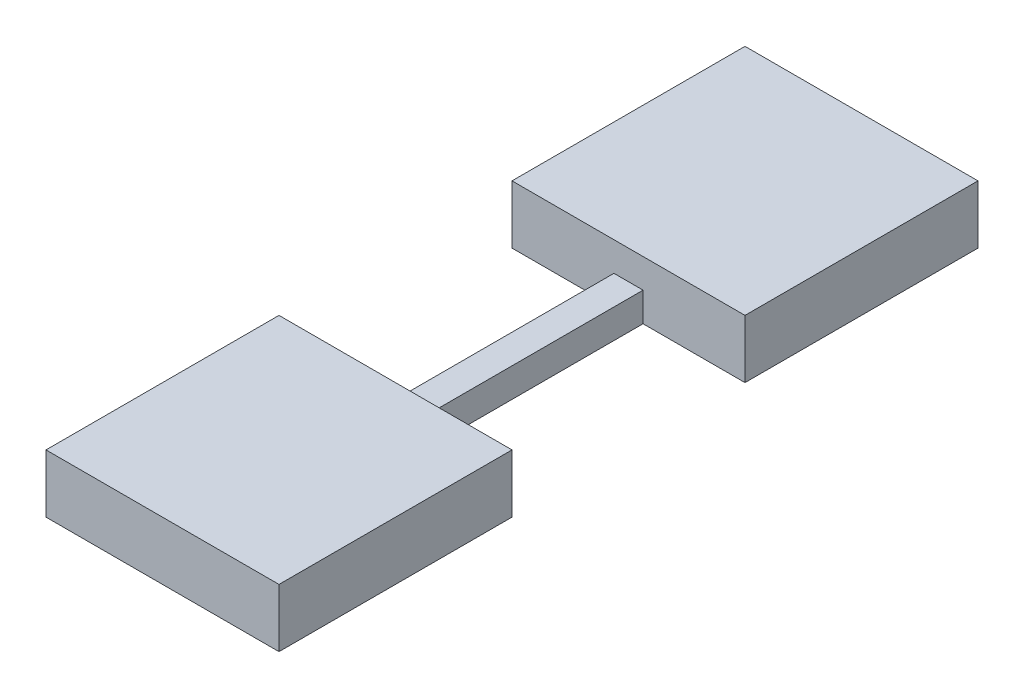
ISO-10303-21;
HEADER;
FILE_DESCRIPTION(('STEP AP214'),'2;1');
FILE_NAME('part.step','',(''),(''),'','','');
FILE_SCHEMA(('AUTOMOTIVE_DESIGN { 1 0 10303 214 1 1 1 1 }'));
ENDSEC;
DATA;
#1=APPLICATION_CONTEXT('core data for automotive mechanical design processes');
#2=APPLICATION_PROTOCOL_DEFINITION('international standard','automotive_design',2000,#1);
#3=PRODUCT_CONTEXT('',#1,'mechanical');
#4=PRODUCT('Part','Part','',(#3));
#5=PRODUCT_RELATED_PRODUCT_CATEGORY('part','',(#4));
#6=PRODUCT_DEFINITION_FORMATION('','',#4);
#7=PRODUCT_DEFINITION_CONTEXT('part definition',#1,'design');
#8=PRODUCT_DEFINITION('design','',#6,#7);
#9=PRODUCT_DEFINITION_SHAPE('','',#8);
#10=(LENGTH_UNIT() NAMED_UNIT(*) SI_UNIT(.MILLI.,.METRE.));
#11=(NAMED_UNIT(*) PLANE_ANGLE_UNIT() SI_UNIT($,.RADIAN.));
#12=(NAMED_UNIT(*) SI_UNIT($,.STERADIAN.) SOLID_ANGLE_UNIT());
#13=UNCERTAINTY_MEASURE_WITH_UNIT(LENGTH_MEASURE(1.E-05),#10,'distance_accuracy_value','');
#14=(GEOMETRIC_REPRESENTATION_CONTEXT(3) GLOBAL_UNCERTAINTY_ASSIGNED_CONTEXT((#13)) GLOBAL_UNIT_ASSIGNED_CONTEXT((#10,
#11,#12)) REPRESENTATION_CONTEXT('',''));
#15=CARTESIAN_POINT('',(0.,0.,0.));
#16=DIRECTION('',(0.,0.,1.));
#17=DIRECTION('',(1.,0.,0.));
#18=AXIS2_PLACEMENT_3D('',#15,#16,#17);
#19=CARTESIAN_POINT('',(0.218586387434555,1.,-2.77486910994764));
#20=DIRECTION('',(-1.,0.,0.));
#21=DIRECTION('',(0.,0.,1.));
#22=AXIS2_PLACEMENT_3D('',#19,#20,#21);
#23=PLANE('',#22);
#24=DIRECTION('',(0.,0.,-1.));
#25=VECTOR('',#24,1.);
#26=CARTESIAN_POINT('',(0.218586387434555,0.5,-2.77486910994764));
#27=LINE('',#26,#25);
#28=CARTESIAN_POINT('',(0.218586387434555,0.5,-2.77486910994764));
#29=VERTEX_POINT('',#28);
#30=CARTESIAN_POINT('',(0.218586387434555,0.5,-6.77486910994764));
#31=VERTEX_POINT('',#30);
#32=EDGE_CURVE('E223',#29,#31,#27,.T.);
#33=ORIENTED_EDGE('',*,*,#32,.F.);
#34=DIRECTION('',(0.,-1.,0.));
#35=VECTOR('',#34,1.);
#36=CARTESIAN_POINT('',(0.218586387434555,1.,-2.77486910994764));
#37=LINE('',#36,#35);
#38=CARTESIAN_POINT('',(0.218586387434555,0.,-2.77486910994764));
#39=VERTEX_POINT('',#38);
#40=EDGE_CURVE('E185',#29,#39,#37,.T.);
#41=ORIENTED_EDGE('',*,*,#40,.T.);
#42=DIRECTION('',(0.,0.,-1.));
#43=VECTOR('',#42,1.);
#44=CARTESIAN_POINT('',(0.218586387434555,0.,-2.77486910994764));
#45=LINE('',#44,#43);
#46=CARTESIAN_POINT('',(0.218586387434555,0.,-6.77486910994764));
#47=VERTEX_POINT('',#46);
#48=EDGE_CURVE('E162',#39,#47,#45,.T.);
#49=ORIENTED_EDGE('',*,*,#48,.T.);
#50=DIRECTION('',(0.,-1.,0.));
#51=VECTOR('',#50,1.);
#52=CARTESIAN_POINT('',(0.218586387434555,1.,-6.77486910994764));
#53=LINE('',#52,#51);
#54=EDGE_CURVE('E183',#31,#47,#53,.T.);
#55=ORIENTED_EDGE('',*,*,#54,.F.);
#56=EDGE_LOOP('',(#33,#41,#49,#55));
#57=FACE_BOUND('',#56,.T.);
#58=ADVANCED_FACE('F32',(#57),#23,.F.);
#59=CARTESIAN_POINT('',(-0.281413612565446,1.,-2.77486910994764));
#60=DIRECTION('',(1.,0.,0.));
#61=DIRECTION('',(0.,0.,-1.));
#62=AXIS2_PLACEMENT_3D('',#59,#60,#61);
#63=PLANE('',#62);
#64=DIRECTION('',(0.,0.,1.));
#65=VECTOR('',#64,1.);
#66=CARTESIAN_POINT('',(-0.281413612565446,0.5,-6.77486910994764));
#67=LINE('',#66,#65);
#68=CARTESIAN_POINT('',(-0.281413612565446,0.5,-6.77486910994764));
#69=VERTEX_POINT('',#68);
#70=CARTESIAN_POINT('',(-0.281413612565446,0.5,-2.77486910994764));
#71=VERTEX_POINT('',#70);
#72=EDGE_CURVE('E229',#69,#71,#67,.T.);
#73=ORIENTED_EDGE('',*,*,#72,.F.);
#74=DIRECTION('',(0.,-1.,0.));
#75=VECTOR('',#74,1.);
#76=CARTESIAN_POINT('',(-0.281413612565446,1.,-6.77486910994764));
#77=LINE('',#76,#75);
#78=CARTESIAN_POINT('',(-0.281413612565446,0.,-6.77486910994764));
#79=VERTEX_POINT('',#78);
#80=EDGE_CURVE('E92',#69,#79,#77,.T.);
#81=ORIENTED_EDGE('',*,*,#80,.T.);
#82=DIRECTION('',(0.,0.,1.));
#83=VECTOR('',#82,1.);
#84=CARTESIAN_POINT('',(-0.281413612565446,0.,-2.77486910994764));
#85=LINE('',#84,#83);
#86=CARTESIAN_POINT('',(-0.281413612565446,0.,-2.77486910994764));
#87=VERTEX_POINT('',#86);
#88=EDGE_CURVE('E174',#79,#87,#85,.T.);
#89=ORIENTED_EDGE('',*,*,#88,.T.);
#90=DIRECTION('',(0.,-1.,0.));
#91=VECTOR('',#90,1.);
#92=CARTESIAN_POINT('',(-0.281413612565446,1.,-2.77486910994764));
#93=LINE('',#92,#91);
#94=EDGE_CURVE('E100',#71,#87,#93,.T.);
#95=ORIENTED_EDGE('',*,*,#94,.F.);
#96=EDGE_LOOP('',(#73,#81,#89,#95));
#97=FACE_BOUND('',#96,.T.);
#98=ADVANCED_FACE('F238',(#97),#63,.F.);
#99=CARTESIAN_POINT('',(0.,1.,0.));
#100=DIRECTION('',(0.,1.,0.));
#101=DIRECTION('',(0.,0.,1.));
#102=AXIS2_PLACEMENT_3D('',#99,#100,#101);
#103=PLANE('',#102);
#104=DIRECTION('',(0.,0.,1.));
#105=VECTOR('',#104,1.);
#106=CARTESIAN_POINT('',(-2.03141361256545,1.,-6.77486910994764));
#107=LINE('',#106,#105);
#108=CARTESIAN_POINT('',(-2.03141361256545,1.,-10.7748691099476));
#109=VERTEX_POINT('',#108);
#110=CARTESIAN_POINT('',(-2.03141361256545,1.,-6.77486910994764));
#111=VERTEX_POINT('',#110);
#112=EDGE_CURVE('E145',#109,#111,#107,.T.);
#113=ORIENTED_EDGE('',*,*,#112,.T.);
#114=DIRECTION('',(1.,0.,0.));
#115=VECTOR('',#114,1.);
#116=CARTESIAN_POINT('',(1.96858638743455,1.,-6.77486910994764));
#117=LINE('',#116,#115);
#118=CARTESIAN_POINT('',(1.96858638743455,1.,-6.77486910994764));
#119=VERTEX_POINT('',#118);
#120=EDGE_CURVE('E49',#111,#119,#117,.T.);
#121=ORIENTED_EDGE('',*,*,#120,.T.);
#122=DIRECTION('',(0.,0.,-1.));
#123=VECTOR('',#122,1.);
#124=CARTESIAN_POINT('',(1.96858638743455,1.,-10.7748691099476));
#125=LINE('',#124,#123);
#126=CARTESIAN_POINT('',(1.96858638743455,1.,-10.7748691099476));
#127=VERTEX_POINT('',#126);
#128=EDGE_CURVE('E123',#119,#127,#125,.T.);
#129=ORIENTED_EDGE('',*,*,#128,.T.);
#130=DIRECTION('',(-1.,0.,0.));
#131=VECTOR('',#130,1.);
#132=CARTESIAN_POINT('',(-2.03141361256545,1.,-10.7748691099476));
#133=LINE('',#132,#131);
#134=EDGE_CURVE('E127',#127,#109,#133,.T.);
#135=ORIENTED_EDGE('',*,*,#134,.T.);
#136=EDGE_LOOP('',(#113,#121,#129,#135));
#137=FACE_BOUND('',#136,.T.);
#138=ADVANCED_FACE('F125',(#137),#103,.T.);
#139=CARTESIAN_POINT('',(-2.03141361256545,1.,-2.77486910994764));
#140=DIRECTION('',(1.,0.,0.));
#141=DIRECTION('',(0.,0.,-1.));
#142=AXIS2_PLACEMENT_3D('',#139,#140,#141);
#143=PLANE('',#142);
#144=DIRECTION('',(0.,0.,1.));
#145=VECTOR('',#144,1.);
#146=CARTESIAN_POINT('',(-2.03141361256545,0.,-2.77486910994764));
#147=LINE('',#146,#145);
#148=CARTESIAN_POINT('',(-2.03141361256545,0.,-2.77486910994764));
#149=VERTEX_POINT('',#148);
#150=CARTESIAN_POINT('',(-2.03141361256545,0.,1.22513089005236));
#151=VERTEX_POINT('',#150);
#152=EDGE_CURVE('E152',#149,#151,#147,.T.);
#153=ORIENTED_EDGE('',*,*,#152,.T.);
#154=DIRECTION('',(0.,-1.,0.));
#155=VECTOR('',#154,1.);
#156=CARTESIAN_POINT('',(-2.03141361256545,1.,1.22513089005236));
#157=LINE('',#156,#155);
#158=CARTESIAN_POINT('',(-2.03141361256545,1.,1.22513089005236));
#159=VERTEX_POINT('',#158);
#160=EDGE_CURVE('E41',#159,#151,#157,.T.);
#161=ORIENTED_EDGE('',*,*,#160,.F.);
#162=DIRECTION('',(0.,0.,1.));
#163=VECTOR('',#162,1.);
#164=CARTESIAN_POINT('',(-2.03141361256545,1.,-2.77486910994764));
#165=LINE('',#164,#163);
#166=CARTESIAN_POINT('',(-2.03141361256545,1.,-2.77486910994764));
#167=VERTEX_POINT('',#166);
#168=EDGE_CURVE('E107',#167,#159,#165,.T.);
#169=ORIENTED_EDGE('',*,*,#168,.F.);
#170=DIRECTION('',(0.,-1.,0.));
#171=VECTOR('',#170,1.);
#172=CARTESIAN_POINT('',(-2.03141361256545,1.,-2.77486910994764));
#173=LINE('',#172,#171);
#174=EDGE_CURVE('E11',#167,#149,#173,.T.);
#175=ORIENTED_EDGE('',*,*,#174,.T.);
#176=EDGE_LOOP('',(#153,#161,#169,#175));
#177=FACE_BOUND('',#176,.T.);
#178=ADVANCED_FACE('F34',(#177),#143,.F.);
#179=CARTESIAN_POINT('',(-2.03141361256545,1.,1.22513089005236));
#180=DIRECTION('',(0.,0.,-1.));
#181=DIRECTION('',(-1.,0.,0.));
#182=AXIS2_PLACEMENT_3D('',#179,#180,#181);
#183=PLANE('',#182);
#184=DIRECTION('',(1.,0.,0.));
#185=VECTOR('',#184,1.);
#186=CARTESIAN_POINT('',(-2.03141361256545,0.,1.22513089005236));
#187=LINE('',#186,#185);
#188=CARTESIAN_POINT('',(1.96858638743456,0.,1.22513089005236));
#189=VERTEX_POINT('',#188);
#190=EDGE_CURVE('E155',#151,#189,#187,.T.);
#191=ORIENTED_EDGE('',*,*,#190,.T.);
#192=DIRECTION('',(0.,-1.,0.));
#193=VECTOR('',#192,1.);
#194=CARTESIAN_POINT('',(1.96858638743456,1.,1.22513089005236));
#195=LINE('',#194,#193);
#196=CARTESIAN_POINT('',(1.96858638743456,1.,1.22513089005236));
#197=VERTEX_POINT('',#196);
#198=EDGE_CURVE('E190',#197,#189,#195,.T.);
#199=ORIENTED_EDGE('',*,*,#198,.F.);
#200=DIRECTION('',(1.,0.,0.));
#201=VECTOR('',#200,1.);
#202=CARTESIAN_POINT('',(-2.03141361256545,1.,1.22513089005236));
#203=LINE('',#202,#201);
#204=EDGE_CURVE('E198',#159,#197,#203,.T.);
#205=ORIENTED_EDGE('',*,*,#204,.F.);
#206=ORIENTED_EDGE('',*,*,#160,.T.);
#207=EDGE_LOOP('',(#191,#199,#205,#206));
#208=FACE_BOUND('',#207,.T.);
#209=ADVANCED_FACE('F196',(#208),#183,.F.);
#210=CARTESIAN_POINT('',(1.96858638743456,1.,1.22513089005236));
#211=DIRECTION('',(-1.,0.,0.));
#212=DIRECTION('',(0.,0.,1.));
#213=AXIS2_PLACEMENT_3D('',#210,#211,#212);
#214=PLANE('',#213);
#215=DIRECTION('',(0.,0.,-1.));
#216=VECTOR('',#215,1.);
#217=CARTESIAN_POINT('',(1.96858638743456,0.,1.22513089005236));
#218=LINE('',#217,#216);
#219=CARTESIAN_POINT('',(1.96858638743456,0.,-2.77486910994764));
#220=VERTEX_POINT('',#219);
#221=EDGE_CURVE('E157',#189,#220,#218,.T.);
#222=ORIENTED_EDGE('',*,*,#221,.T.);
#223=DIRECTION('',(0.,-1.,0.));
#224=VECTOR('',#223,1.);
#225=CARTESIAN_POINT('',(1.96858638743456,1.,-2.77486910994764));
#226=LINE('',#225,#224);
#227=CARTESIAN_POINT('',(1.96858638743456,1.,-2.77486910994764));
#228=VERTEX_POINT('',#227);
#229=EDGE_CURVE('E187',#228,#220,#226,.T.);
#230=ORIENTED_EDGE('',*,*,#229,.F.);
#231=DIRECTION('',(0.,0.,-1.));
#232=VECTOR('',#231,1.);
#233=CARTESIAN_POINT('',(1.96858638743456,1.,1.22513089005236));
#234=LINE('',#233,#232);
#235=EDGE_CURVE('E215',#197,#228,#234,.T.);
#236=ORIENTED_EDGE('',*,*,#235,.F.);
#237=ORIENTED_EDGE('',*,*,#198,.T.);
#238=EDGE_LOOP('',(#222,#230,#236,#237));
#239=FACE_BOUND('',#238,.T.);
#240=ADVANCED_FACE('F207',(#239),#214,.F.);
#241=CARTESIAN_POINT('',(1.96858638743456,1.,-2.77486910994764));
#242=DIRECTION('',(0.,0.,1.));
#243=DIRECTION('',(1.,0.,0.));
#244=AXIS2_PLACEMENT_3D('',#241,#242,#243);
#245=PLANE('',#244);
#246=DIRECTION('',(-1.,0.,0.));
#247=VECTOR('',#246,1.);
#248=CARTESIAN_POINT('',(1.96858638743456,0.,-2.77486910994764));
#249=LINE('',#248,#247);
#250=EDGE_CURVE('E159',#220,#39,#249,.T.);
#251=ORIENTED_EDGE('',*,*,#250,.T.);
#252=ORIENTED_EDGE('',*,*,#40,.F.);
#253=DIRECTION('',(1.,0.,0.));
#254=VECTOR('',#253,1.);
#255=CARTESIAN_POINT('',(-0.281413612565446,0.5,-2.77486910994764));
#256=LINE('',#255,#254);
#257=EDGE_CURVE('E226',#71,#29,#256,.T.);
#258=ORIENTED_EDGE('',*,*,#257,.F.);
#259=ORIENTED_EDGE('',*,*,#94,.T.);
#260=DIRECTION('',(-1.,0.,0.));
#261=VECTOR('',#260,1.);
#262=CARTESIAN_POINT('',(-2.03141361256545,0.,-2.77486910994764));
#263=LINE('',#262,#261);
#264=EDGE_CURVE('E150',#87,#149,#263,.T.);
#265=ORIENTED_EDGE('',*,*,#264,.T.);
#266=ORIENTED_EDGE('',*,*,#174,.F.);
#267=DIRECTION('',(-1.,0.,0.));
#268=VECTOR('',#267,1.);
#269=CARTESIAN_POINT('',(-2.03141361256545,1.,-2.77486910994764));
#270=LINE('',#269,#268);
#271=EDGE_CURVE('E176',#228,#167,#270,.T.);
#272=ORIENTED_EDGE('',*,*,#271,.F.);
#273=ORIENTED_EDGE('',*,*,#229,.T.);
#274=EDGE_LOOP('',(#251,#252,#258,#259,#265,#266,#272,#273));
#275=FACE_BOUND('',#274,.T.);
#276=ADVANCED_FACE('F209',(#275),#245,.F.);
#277=CARTESIAN_POINT('',(1.96858638743455,1.,-10.7748691099476));
#278=DIRECTION('',(-1.,0.,0.));
#279=DIRECTION('',(0.,0.,1.));
#280=AXIS2_PLACEMENT_3D('',#277,#278,#279);
#281=PLANE('',#280);
#282=DIRECTION('',(0.,0.,-1.));
#283=VECTOR('',#282,1.);
#284=CARTESIAN_POINT('',(1.96858638743455,0.,-10.7748691099476));
#285=LINE('',#284,#283);
#286=CARTESIAN_POINT('',(1.96858638743455,0.,-6.77486910994764));
#287=VERTEX_POINT('',#286);
#288=CARTESIAN_POINT('',(1.96858638743455,0.,-10.7748691099476));
#289=VERTEX_POINT('',#288);
#290=EDGE_CURVE('E136',#287,#289,#285,.T.);
#291=ORIENTED_EDGE('',*,*,#290,.T.);
#292=DIRECTION('',(0.,-1.,0.));
#293=VECTOR('',#292,1.);
#294=CARTESIAN_POINT('',(1.96858638743455,1.,-10.7748691099476));
#295=LINE('',#294,#293);
#296=EDGE_CURVE('E133',#127,#289,#295,.T.);
#297=ORIENTED_EDGE('',*,*,#296,.F.);
#298=ORIENTED_EDGE('',*,*,#128,.F.);
#299=DIRECTION('',(0.,-1.,0.));
#300=VECTOR('',#299,1.);
#301=CARTESIAN_POINT('',(1.96858638743455,1.,-6.77486910994764));
#302=LINE('',#301,#300);
#303=EDGE_CURVE('E139',#119,#287,#302,.T.);
#304=ORIENTED_EDGE('',*,*,#303,.T.);
#305=EDGE_LOOP('',(#291,#297,#298,#304));
#306=FACE_BOUND('',#305,.T.);
#307=ADVANCED_FACE('F134',(#306),#281,.F.);
#308=CARTESIAN_POINT('',(-2.03141361256545,1.,-10.7748691099476));
#309=DIRECTION('',(0.,0.,1.));
#310=DIRECTION('',(1.,0.,0.));
#311=AXIS2_PLACEMENT_3D('',#308,#309,#310);
#312=PLANE('',#311);
#313=DIRECTION('',(-1.,0.,0.));
#314=VECTOR('',#313,1.);
#315=CARTESIAN_POINT('',(-2.03141361256545,0.,-10.7748691099476));
#316=LINE('',#315,#314);
#317=CARTESIAN_POINT('',(-2.03141361256545,0.,-10.7748691099476));
#318=VERTEX_POINT('',#317);
#319=EDGE_CURVE('E168',#289,#318,#316,.T.);
#320=ORIENTED_EDGE('',*,*,#319,.T.);
#321=DIRECTION('',(0.,-1.,0.));
#322=VECTOR('',#321,1.);
#323=CARTESIAN_POINT('',(-2.03141361256545,1.,-10.7748691099476));
#324=LINE('',#323,#322);
#325=EDGE_CURVE('E140',#109,#318,#324,.T.);
#326=ORIENTED_EDGE('',*,*,#325,.F.);
#327=ORIENTED_EDGE('',*,*,#134,.F.);
#328=ORIENTED_EDGE('',*,*,#296,.T.);
#329=EDGE_LOOP('',(#320,#326,#327,#328));
#330=FACE_BOUND('',#329,.T.);
#331=ADVANCED_FACE('F142',(#330),#312,.F.);
#332=CARTESIAN_POINT('',(-2.03141361256545,1.,-6.77486910994764));
#333=DIRECTION('',(1.,0.,0.));
#334=DIRECTION('',(0.,0.,-1.));
#335=AXIS2_PLACEMENT_3D('',#332,#333,#334);
#336=PLANE('',#335);
#337=DIRECTION('',(0.,0.,1.));
#338=VECTOR('',#337,1.);
#339=CARTESIAN_POINT('',(-2.03141361256545,0.,-6.77486910994764));
#340=LINE('',#339,#338);
#341=CARTESIAN_POINT('',(-2.03141361256545,0.,-6.77486910994764));
#342=VERTEX_POINT('',#341);
#343=EDGE_CURVE('E170',#318,#342,#340,.T.);
#344=ORIENTED_EDGE('',*,*,#343,.T.);
#345=DIRECTION('',(0.,-1.,0.));
#346=VECTOR('',#345,1.);
#347=CARTESIAN_POINT('',(-2.03141361256545,1.,-6.77486910994764));
#348=LINE('',#347,#346);
#349=EDGE_CURVE('E179',#111,#342,#348,.T.);
#350=ORIENTED_EDGE('',*,*,#349,.F.);
#351=ORIENTED_EDGE('',*,*,#112,.F.);
#352=ORIENTED_EDGE('',*,*,#325,.T.);
#353=EDGE_LOOP('',(#344,#350,#351,#352));
#354=FACE_BOUND('',#353,.T.);
#355=ADVANCED_FACE('F245',(#354),#336,.F.);
#356=CARTESIAN_POINT('',(-0.281413612565446,1.,-6.77486910994764));
#357=DIRECTION('',(0.,0.,-1.));
#358=DIRECTION('',(-1.,0.,0.));
#359=AXIS2_PLACEMENT_3D('',#356,#357,#358);
#360=PLANE('',#359);
#361=DIRECTION('',(1.,0.,0.));
#362=VECTOR('',#361,1.);
#363=CARTESIAN_POINT('',(-0.281413612565446,0.,-6.77486910994764));
#364=LINE('',#363,#362);
#365=EDGE_CURVE('E172',#342,#79,#364,.T.);
#366=ORIENTED_EDGE('',*,*,#365,.T.);
#367=ORIENTED_EDGE('',*,*,#80,.F.);
#368=DIRECTION('',(-1.,0.,0.));
#369=VECTOR('',#368,1.);
#370=CARTESIAN_POINT('',(0.218586387434555,0.5,-6.77486910994764));
#371=LINE('',#370,#369);
#372=EDGE_CURVE('E153',#31,#69,#371,.T.);
#373=ORIENTED_EDGE('',*,*,#372,.F.);
#374=ORIENTED_EDGE('',*,*,#54,.T.);
#375=DIRECTION('',(1.,0.,0.));
#376=VECTOR('',#375,1.);
#377=CARTESIAN_POINT('',(1.96858638743455,0.,-6.77486910994764));
#378=LINE('',#377,#376);
#379=EDGE_CURVE('E165',#47,#287,#378,.T.);
#380=ORIENTED_EDGE('',*,*,#379,.T.);
#381=ORIENTED_EDGE('',*,*,#303,.F.);
#382=ORIENTED_EDGE('',*,*,#120,.F.);
#383=ORIENTED_EDGE('',*,*,#349,.T.);
#384=EDGE_LOOP('',(#366,#367,#373,#374,#380,#381,#382,#383));
#385=FACE_BOUND('',#384,.T.);
#386=ADVANCED_FACE('F242',(#385),#360,.F.);
#387=ORIENTED_EDGE('',*,*,#235,.T.);
#388=ORIENTED_EDGE('',*,*,#271,.T.);
#389=ORIENTED_EDGE('',*,*,#168,.T.);
#390=ORIENTED_EDGE('',*,*,#204,.T.);
#391=EDGE_LOOP('',(#387,#388,#389,#390));
#392=FACE_BOUND('',#391,.T.);
#393=ADVANCED_FACE('F216',(#392),#103,.T.);
#394=CARTESIAN_POINT('',(0.,0.,0.));
#395=DIRECTION('',(0.,1.,0.));
#396=DIRECTION('',(0.,0.,1.));
#397=AXIS2_PLACEMENT_3D('',#394,#395,#396);
#398=PLANE('',#397);
#399=ORIENTED_EDGE('',*,*,#264,.F.);
#400=ORIENTED_EDGE('',*,*,#88,.F.);
#401=ORIENTED_EDGE('',*,*,#365,.F.);
#402=ORIENTED_EDGE('',*,*,#343,.F.);
#403=ORIENTED_EDGE('',*,*,#319,.F.);
#404=ORIENTED_EDGE('',*,*,#290,.F.);
#405=ORIENTED_EDGE('',*,*,#379,.F.);
#406=ORIENTED_EDGE('',*,*,#48,.F.);
#407=ORIENTED_EDGE('',*,*,#250,.F.);
#408=ORIENTED_EDGE('',*,*,#221,.F.);
#409=ORIENTED_EDGE('',*,*,#190,.F.);
#410=ORIENTED_EDGE('',*,*,#152,.F.);
#411=EDGE_LOOP('',(#399,#400,#401,#402,#403,#404,#405,#406,#407,#408,#409,#410));
#412=FACE_BOUND('',#411,.T.);
#413=ADVANCED_FACE('F202',(#412),#398,.F.);
#414=CARTESIAN_POINT('',(0.,0.5,0.));
#415=DIRECTION('',(0.,1.,0.));
#416=DIRECTION('',(0.,0.,1.));
#417=AXIS2_PLACEMENT_3D('',#414,#415,#416);
#418=PLANE('',#417);
#419=ORIENTED_EDGE('',*,*,#72,.T.);
#420=ORIENTED_EDGE('',*,*,#257,.T.);
#421=ORIENTED_EDGE('',*,*,#32,.T.);
#422=ORIENTED_EDGE('',*,*,#372,.T.);
#423=EDGE_LOOP('',(#419,#420,#421,#422));
#424=FACE_BOUND('',#423,.T.);
#425=ADVANCED_FACE('F233',(#424),#418,.T.);
#426=CLOSED_SHELL('',(#58,#98,#138,#178,#209,#240,#276,#307,#331,#355,#386,#393,#413,#425));
#427=MANIFOLD_SOLID_BREP('B2',#426);
#428=ADVANCED_BREP_SHAPE_REPRESENTATION('',(#18,#427),#14);
#429=SHAPE_DEFINITION_REPRESENTATION(#9,#428);
ENDSEC;
END-ISO-10303-21;
